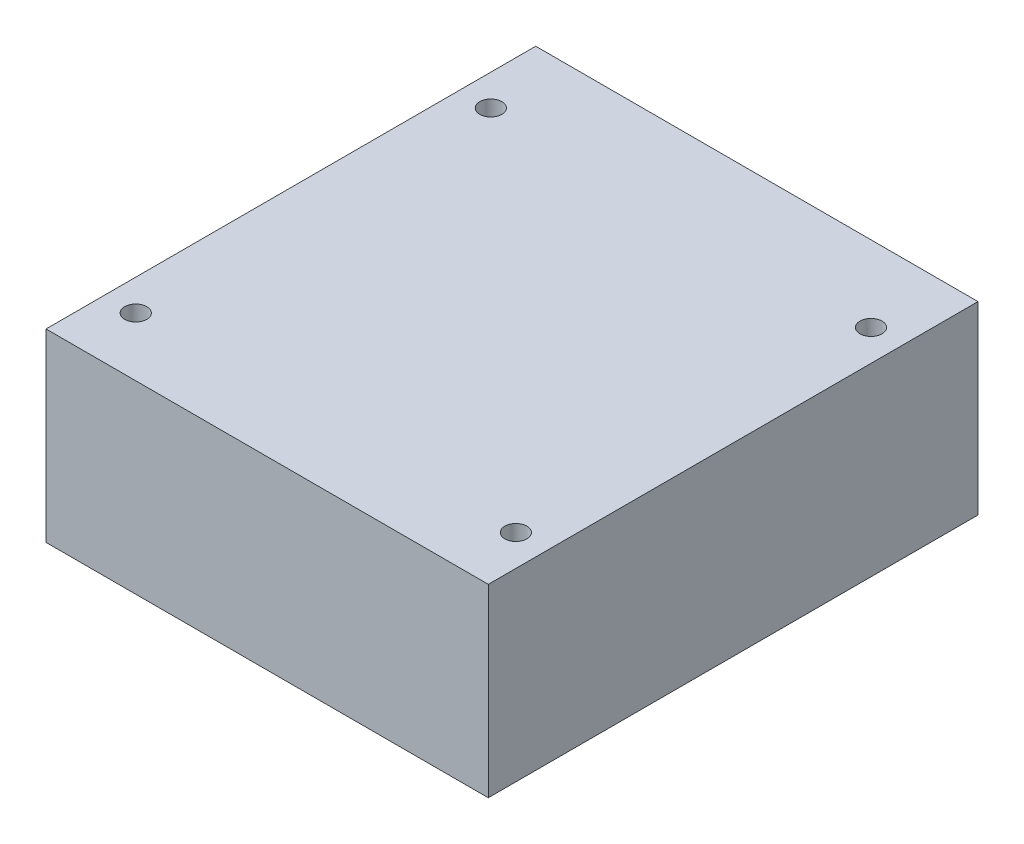
ISO-10303-21;
HEADER;
FILE_DESCRIPTION(('STEP AP214'),'2;1');
FILE_NAME('part.step','',(''),(''),'','','');
FILE_SCHEMA(('AUTOMOTIVE_DESIGN { 1 0 10303 214 1 1 1 1 }'));
ENDSEC;
DATA;
#1=APPLICATION_CONTEXT('core data for automotive mechanical design processes');
#2=APPLICATION_PROTOCOL_DEFINITION('international standard','automotive_design',2000,#1);
#3=PRODUCT_CONTEXT('',#1,'mechanical');
#4=PRODUCT('Part','Part','',(#3));
#5=PRODUCT_RELATED_PRODUCT_CATEGORY('part','',(#4));
#6=PRODUCT_DEFINITION_FORMATION('','',#4);
#7=PRODUCT_DEFINITION_CONTEXT('part definition',#1,'design');
#8=PRODUCT_DEFINITION('design','',#6,#7);
#9=PRODUCT_DEFINITION_SHAPE('','',#8);
#10=(LENGTH_UNIT() NAMED_UNIT(*) SI_UNIT(.MILLI.,.METRE.));
#11=(NAMED_UNIT(*) PLANE_ANGLE_UNIT() SI_UNIT($,.RADIAN.));
#12=(NAMED_UNIT(*) SI_UNIT($,.STERADIAN.) SOLID_ANGLE_UNIT());
#13=UNCERTAINTY_MEASURE_WITH_UNIT(LENGTH_MEASURE(1.E-05),#10,'distance_accuracy_value','');
#14=(GEOMETRIC_REPRESENTATION_CONTEXT(3) GLOBAL_UNCERTAINTY_ASSIGNED_CONTEXT((#13)) GLOBAL_UNIT_ASSIGNED_CONTEXT((#10,
#11,#12)) REPRESENTATION_CONTEXT('',''));
#15=CARTESIAN_POINT('',(0.,0.,0.));
#16=DIRECTION('',(0.,0.,1.));
#17=DIRECTION('',(1.,0.,0.));
#18=AXIS2_PLACEMENT_3D('',#15,#16,#17);
#19=CARTESIAN_POINT('',(32.035,26.78,-35.47));
#20=DIRECTION('',(-1.,0.,0.));
#21=DIRECTION('',(0.,0.,1.));
#22=AXIS2_PLACEMENT_3D('',#19,#20,#21);
#23=PLANE('',#22);
#24=DIRECTION('',(0.,0.,-1.));
#25=VECTOR('',#24,1.);
#26=CARTESIAN_POINT('',(32.035,0.,-35.47));
#27=LINE('',#26,#25);
#28=CARTESIAN_POINT('',(32.035,0.,35.47));
#29=VERTEX_POINT('',#28);
#30=CARTESIAN_POINT('',(32.035,0.,-35.47));
#31=VERTEX_POINT('',#30);
#32=EDGE_CURVE('E115',#29,#31,#27,.T.);
#33=ORIENTED_EDGE('',*,*,#32,.T.);
#34=DIRECTION('',(0.,-1.,0.));
#35=VECTOR('',#34,1.);
#36=CARTESIAN_POINT('',(32.035,26.78,-35.47));
#37=LINE('',#36,#35);
#38=CARTESIAN_POINT('',(32.035,26.78,-35.47));
#39=VERTEX_POINT('',#38);
#40=EDGE_CURVE('E11',#39,#31,#37,.T.);
#41=ORIENTED_EDGE('',*,*,#40,.F.);
#42=DIRECTION('',(0.,0.,-1.));
#43=VECTOR('',#42,1.);
#44=CARTESIAN_POINT('',(32.035,26.78,-35.47));
#45=LINE('',#44,#43);
#46=CARTESIAN_POINT('',(32.035,26.78,35.47));
#47=VERTEX_POINT('',#46);
#48=EDGE_CURVE('E99',#47,#39,#45,.T.);
#49=ORIENTED_EDGE('',*,*,#48,.F.);
#50=DIRECTION('',(0.,-1.,0.));
#51=VECTOR('',#50,1.);
#52=CARTESIAN_POINT('',(32.035,26.78,35.47));
#53=LINE('',#52,#51);
#54=EDGE_CURVE('E111',#47,#29,#53,.T.);
#55=ORIENTED_EDGE('',*,*,#54,.T.);
#56=EDGE_LOOP('',(#33,#41,#49,#55));
#57=FACE_BOUND('',#56,.T.);
#58=ADVANCED_FACE('F47',(#57),#23,.F.);
#59=CARTESIAN_POINT('',(-32.035,26.78,-35.47));
#60=DIRECTION('',(0.,0.,1.));
#61=DIRECTION('',(1.,0.,0.));
#62=AXIS2_PLACEMENT_3D('',#59,#60,#61);
#63=PLANE('',#62);
#64=DIRECTION('',(-1.,0.,0.));
#65=VECTOR('',#64,1.);
#66=CARTESIAN_POINT('',(-32.035,0.,-35.47));
#67=LINE('',#66,#65);
#68=CARTESIAN_POINT('',(-32.035,0.,-35.47));
#69=VERTEX_POINT('',#68);
#70=EDGE_CURVE('E104',#31,#69,#67,.T.);
#71=ORIENTED_EDGE('',*,*,#70,.T.);
#72=DIRECTION('',(0.,-1.,0.));
#73=VECTOR('',#72,1.);
#74=CARTESIAN_POINT('',(-32.035,26.78,-35.47));
#75=LINE('',#74,#73);
#76=CARTESIAN_POINT('',(-32.035,26.78,-35.47));
#77=VERTEX_POINT('',#76);
#78=EDGE_CURVE('E56',#77,#69,#75,.T.);
#79=ORIENTED_EDGE('',*,*,#78,.F.);
#80=DIRECTION('',(-1.,0.,0.));
#81=VECTOR('',#80,1.);
#82=CARTESIAN_POINT('',(-32.035,26.78,-35.47));
#83=LINE('',#82,#81);
#84=EDGE_CURVE('E94',#39,#77,#83,.T.);
#85=ORIENTED_EDGE('',*,*,#84,.F.);
#86=ORIENTED_EDGE('',*,*,#40,.T.);
#87=EDGE_LOOP('',(#71,#79,#85,#86));
#88=FACE_BOUND('',#87,.T.);
#89=ADVANCED_FACE('F103',(#88),#63,.F.);
#90=CARTESIAN_POINT('',(-32.035,26.78,-35.47));
#91=DIRECTION('',(1.,0.,0.));
#92=DIRECTION('',(0.,0.,-1.));
#93=AXIS2_PLACEMENT_3D('',#90,#91,#92);
#94=PLANE('',#93);
#95=DIRECTION('',(0.,0.,1.));
#96=VECTOR('',#95,1.);
#97=CARTESIAN_POINT('',(-32.035,0.,-35.47));
#98=LINE('',#97,#96);
#99=CARTESIAN_POINT('',(-32.035,0.,35.47));
#100=VERTEX_POINT('',#99);
#101=EDGE_CURVE('E81',#69,#100,#98,.T.);
#102=ORIENTED_EDGE('',*,*,#101,.T.);
#103=DIRECTION('',(0.,-1.,0.));
#104=VECTOR('',#103,1.);
#105=CARTESIAN_POINT('',(-32.035,26.78,35.47));
#106=LINE('',#105,#104);
#107=CARTESIAN_POINT('',(-32.035,26.78,35.47));
#108=VERTEX_POINT('',#107);
#109=EDGE_CURVE('E106',#108,#100,#106,.T.);
#110=ORIENTED_EDGE('',*,*,#109,.F.);
#111=DIRECTION('',(0.,0.,1.));
#112=VECTOR('',#111,1.);
#113=CARTESIAN_POINT('',(-32.035,26.78,-35.47));
#114=LINE('',#113,#112);
#115=EDGE_CURVE('E97',#77,#108,#114,.T.);
#116=ORIENTED_EDGE('',*,*,#115,.F.);
#117=ORIENTED_EDGE('',*,*,#78,.T.);
#118=EDGE_LOOP('',(#102,#110,#116,#117));
#119=FACE_BOUND('',#118,.T.);
#120=ADVANCED_FACE('F107',(#119),#94,.F.);
#121=CARTESIAN_POINT('',(-32.035,26.78,35.47));
#122=DIRECTION('',(0.,0.,-1.));
#123=DIRECTION('',(-1.,0.,0.));
#124=AXIS2_PLACEMENT_3D('',#121,#122,#123);
#125=PLANE('',#124);
#126=DIRECTION('',(1.,0.,0.));
#127=VECTOR('',#126,1.);
#128=CARTESIAN_POINT('',(-32.035,0.,35.47));
#129=LINE('',#128,#127);
#130=EDGE_CURVE('E87',#100,#29,#129,.T.);
#131=ORIENTED_EDGE('',*,*,#130,.T.);
#132=ORIENTED_EDGE('',*,*,#54,.F.);
#133=DIRECTION('',(1.,0.,0.));
#134=VECTOR('',#133,1.);
#135=CARTESIAN_POINT('',(-32.035,26.78,35.47));
#136=LINE('',#135,#134);
#137=EDGE_CURVE('E64',#108,#47,#136,.T.);
#138=ORIENTED_EDGE('',*,*,#137,.F.);
#139=ORIENTED_EDGE('',*,*,#109,.T.);
#140=EDGE_LOOP('',(#131,#132,#138,#139));
#141=FACE_BOUND('',#140,.T.);
#142=ADVANCED_FACE('F129',(#141),#125,.F.);
#143=CARTESIAN_POINT('',(0.,26.78,0.));
#144=DIRECTION('',(0.,1.,0.));
#145=DIRECTION('',(0.,0.,1.));
#146=AXIS2_PLACEMENT_3D('',#143,#144,#145);
#147=PLANE('',#146);
#148=CARTESIAN_POINT('',(27.535,26.78,-24.47));
#149=DIRECTION('',(0.,1.,0.));
#150=DIRECTION('',(0.,0.,-1.));
#151=AXIS2_PLACEMENT_3D('',#148,#149,#150);
#152=CIRCLE('',#151,1.6);
#153=CARTESIAN_POINT('',(27.535,26.78,-22.87));
#154=VERTEX_POINT('',#153);
#155=EDGE_CURVE('E140',#154,#154,#152,.T.);
#156=ORIENTED_EDGE('',*,*,#155,.F.);
#157=EDGE_LOOP('',(#156));
#158=FACE_BOUND('',#157,.T.);
#159=CARTESIAN_POINT('',(-27.535,26.78,26.97));
#160=DIRECTION('',(0.,1.,0.));
#161=DIRECTION('',(0.,0.,1.));
#162=AXIS2_PLACEMENT_3D('',#159,#160,#161);
#163=CIRCLE('',#162,1.6);
#164=CARTESIAN_POINT('',(-27.535,26.78,28.57));
#165=VERTEX_POINT('',#164);
#166=EDGE_CURVE('E148',#165,#165,#163,.T.);
#167=ORIENTED_EDGE('',*,*,#166,.F.);
#168=EDGE_LOOP('',(#167));
#169=FACE_BOUND('',#168,.T.);
#170=CARTESIAN_POINT('',(27.535,26.78,26.97));
#171=DIRECTION('',(0.,1.,0.));
#172=DIRECTION('',(0.,0.,-1.));
#173=AXIS2_PLACEMENT_3D('',#170,#171,#172);
#174=CIRCLE('',#173,1.6);
#175=CARTESIAN_POINT('',(27.535,26.78,28.57));
#176=VERTEX_POINT('',#175);
#177=EDGE_CURVE('E149',#176,#176,#174,.T.);
#178=ORIENTED_EDGE('',*,*,#177,.F.);
#179=EDGE_LOOP('',(#178));
#180=FACE_BOUND('',#179,.T.);
#181=CARTESIAN_POINT('',(-27.535,26.78,-24.47));
#182=DIRECTION('',(0.,1.,0.));
#183=DIRECTION('',(0.,0.,1.));
#184=AXIS2_PLACEMENT_3D('',#181,#182,#183);
#185=CIRCLE('',#184,1.6);
#186=CARTESIAN_POINT('',(-27.535,26.78,-22.87));
#187=VERTEX_POINT('',#186);
#188=EDGE_CURVE('E136',#187,#187,#185,.T.);
#189=ORIENTED_EDGE('',*,*,#188,.F.);
#190=EDGE_LOOP('',(#189));
#191=FACE_BOUND('',#190,.T.);
#192=ORIENTED_EDGE('',*,*,#48,.T.);
#193=ORIENTED_EDGE('',*,*,#84,.T.);
#194=ORIENTED_EDGE('',*,*,#115,.T.);
#195=ORIENTED_EDGE('',*,*,#137,.T.);
#196=EDGE_LOOP('',(#192,#193,#194,#195));
#197=FACE_BOUND('',#196,.T.);
#198=ADVANCED_FACE('F95',(#158,#169,#180,#191,#197),#147,.T.);
#199=CARTESIAN_POINT('',(0.,0.,0.));
#200=DIRECTION('',(0.,1.,0.));
#201=DIRECTION('',(0.,0.,1.));
#202=AXIS2_PLACEMENT_3D('',#199,#200,#201);
#203=PLANE('',#202);
#204=CARTESIAN_POINT('',(27.535,0.,-24.47));
#205=DIRECTION('',(0.,1.,0.));
#206=DIRECTION('',(0.,0.,-1.));
#207=AXIS2_PLACEMENT_3D('',#204,#205,#206);
#208=CIRCLE('',#207,1.6);
#209=CARTESIAN_POINT('',(27.535,0.,-22.87));
#210=VERTEX_POINT('',#209);
#211=EDGE_CURVE('E153',#210,#210,#208,.T.);
#212=ORIENTED_EDGE('',*,*,#211,.T.);
#213=EDGE_LOOP('',(#212));
#214=FACE_BOUND('',#213,.T.);
#215=CARTESIAN_POINT('',(-27.535,0.,26.97));
#216=DIRECTION('',(0.,1.,0.));
#217=DIRECTION('',(0.,0.,1.));
#218=AXIS2_PLACEMENT_3D('',#215,#216,#217);
#219=CIRCLE('',#218,1.6);
#220=CARTESIAN_POINT('',(-27.535,0.,28.57));
#221=VERTEX_POINT('',#220);
#222=EDGE_CURVE('E144',#221,#221,#219,.T.);
#223=ORIENTED_EDGE('',*,*,#222,.T.);
#224=EDGE_LOOP('',(#223));
#225=FACE_BOUND('',#224,.T.);
#226=CARTESIAN_POINT('',(27.535,0.,26.97));
#227=DIRECTION('',(0.,1.,0.));
#228=DIRECTION('',(0.,0.,-1.));
#229=AXIS2_PLACEMENT_3D('',#226,#227,#228);
#230=CIRCLE('',#229,1.6);
#231=CARTESIAN_POINT('',(27.535,0.,28.57));
#232=VERTEX_POINT('',#231);
#233=EDGE_CURVE('E160',#232,#232,#230,.T.);
#234=ORIENTED_EDGE('',*,*,#233,.T.);
#235=EDGE_LOOP('',(#234));
#236=FACE_BOUND('',#235,.T.);
#237=CARTESIAN_POINT('',(-27.535,0.,-24.47));
#238=DIRECTION('',(0.,1.,0.));
#239=DIRECTION('',(0.,0.,1.));
#240=AXIS2_PLACEMENT_3D('',#237,#238,#239);
#241=CIRCLE('',#240,1.6);
#242=CARTESIAN_POINT('',(-27.535,0.,-22.87));
#243=VERTEX_POINT('',#242);
#244=EDGE_CURVE('E119',#243,#243,#241,.T.);
#245=ORIENTED_EDGE('',*,*,#244,.T.);
#246=EDGE_LOOP('',(#245));
#247=FACE_BOUND('',#246,.T.);
#248=ORIENTED_EDGE('',*,*,#32,.F.);
#249=ORIENTED_EDGE('',*,*,#130,.F.);
#250=ORIENTED_EDGE('',*,*,#101,.F.);
#251=ORIENTED_EDGE('',*,*,#70,.F.);
#252=EDGE_LOOP('',(#248,#249,#250,#251));
#253=FACE_BOUND('',#252,.T.);
#254=ADVANCED_FACE('F132',(#214,#225,#236,#247,#253),#203,.F.);
#255=CARTESIAN_POINT('',(-27.535,0.,-24.47));
#256=DIRECTION('',(0.,1.,0.));
#257=DIRECTION('',(0.,0.,1.));
#258=AXIS2_PLACEMENT_3D('',#255,#256,#257);
#259=CYLINDRICAL_SURFACE('',#258,1.6);
#260=CARTESIAN_POINT('',(-27.535,0.,-22.87));
#261=CARTESIAN_POINT('',(-27.535,0.278958333333333,-22.87));
#262=CARTESIAN_POINT('',(-27.535,0.557916666666667,-22.87));
#263=CARTESIAN_POINT('',(-27.535,1.11583333333333,-22.87));
#264=CARTESIAN_POINT('',(-27.535,1.39479166666667,-22.87));
#265=CARTESIAN_POINT('',(-27.535,1.95270833333333,-22.87));
#266=CARTESIAN_POINT('',(-27.535,2.23166666666667,-22.87));
#267=CARTESIAN_POINT('',(-27.535,2.78958333333333,-22.87));
#268=CARTESIAN_POINT('',(-27.535,3.06854166666667,-22.87));
#269=CARTESIAN_POINT('',(-27.535,3.62645833333333,-22.87));
#270=CARTESIAN_POINT('',(-27.535,3.90541666666667,-22.87));
#271=CARTESIAN_POINT('',(-27.535,4.46333333333333,-22.87));
#272=CARTESIAN_POINT('',(-27.535,4.74229166666667,-22.87));
#273=CARTESIAN_POINT('',(-27.535,5.30020833333333,-22.87));
#274=CARTESIAN_POINT('',(-27.535,5.57916666666667,-22.87));
#275=CARTESIAN_POINT('',(-27.535,6.13708333333333,-22.87));
#276=CARTESIAN_POINT('',(-27.535,6.41604166666667,-22.87));
#277=CARTESIAN_POINT('',(-27.535,6.97395833333333,-22.87));
#278=CARTESIAN_POINT('',(-27.535,7.25291666666667,-22.87));
#279=CARTESIAN_POINT('',(-27.535,7.81083333333333,-22.87));
#280=CARTESIAN_POINT('',(-27.535,8.08979166666667,-22.87));
#281=CARTESIAN_POINT('',(-27.535,8.64770833333333,-22.87));
#282=CARTESIAN_POINT('',(-27.535,8.92666666666667,-22.87));
#283=CARTESIAN_POINT('',(-27.535,9.48458333333333,-22.87));
#284=CARTESIAN_POINT('',(-27.535,9.76354166666667,-22.87));
#285=CARTESIAN_POINT('',(-27.535,10.3214583333333,-22.87));
#286=CARTESIAN_POINT('',(-27.535,10.6004166666667,-22.87));
#287=CARTESIAN_POINT('',(-27.535,11.1583333333333,-22.87));
#288=CARTESIAN_POINT('',(-27.535,11.4372916666667,-22.87));
#289=CARTESIAN_POINT('',(-27.535,11.9952083333333,-22.87));
#290=CARTESIAN_POINT('',(-27.535,12.2741666666667,-22.87));
#291=CARTESIAN_POINT('',(-27.535,12.8320833333333,-22.87));
#292=CARTESIAN_POINT('',(-27.535,13.1110416666667,-22.87));
#293=CARTESIAN_POINT('',(-27.535,13.6689583333333,-22.87));
#294=CARTESIAN_POINT('',(-27.535,13.9479166666667,-22.87));
#295=CARTESIAN_POINT('',(-27.535,14.5058333333333,-22.87));
#296=CARTESIAN_POINT('',(-27.535,14.7847916666667,-22.87));
#297=CARTESIAN_POINT('',(-27.535,15.3427083333333,-22.87));
#298=CARTESIAN_POINT('',(-27.535,15.6216666666667,-22.87));
#299=CARTESIAN_POINT('',(-27.535,16.1795833333333,-22.87));
#300=CARTESIAN_POINT('',(-27.535,16.4585416666667,-22.87));
#301=CARTESIAN_POINT('',(-27.535,17.0164583333333,-22.87));
#302=CARTESIAN_POINT('',(-27.535,17.2954166666667,-22.87));
#303=CARTESIAN_POINT('',(-27.535,17.8533333333333,-22.87));
#304=CARTESIAN_POINT('',(-27.535,18.1322916666667,-22.87));
#305=CARTESIAN_POINT('',(-27.535,18.6902083333333,-22.87));
#306=CARTESIAN_POINT('',(-27.535,18.9691666666667,-22.87));
#307=CARTESIAN_POINT('',(-27.535,19.5270833333333,-22.87));
#308=CARTESIAN_POINT('',(-27.535,19.8060416666667,-22.87));
#309=CARTESIAN_POINT('',(-27.535,20.3639583333333,-22.87));
#310=CARTESIAN_POINT('',(-27.535,20.6429166666667,-22.87));
#311=CARTESIAN_POINT('',(-27.535,21.2008333333333,-22.87));
#312=CARTESIAN_POINT('',(-27.535,21.4797916666667,-22.87));
#313=CARTESIAN_POINT('',(-27.535,22.0377083333333,-22.87));
#314=CARTESIAN_POINT('',(-27.535,22.3166666666667,-22.87));
#315=CARTESIAN_POINT('',(-27.535,22.8745833333333,-22.87));
#316=CARTESIAN_POINT('',(-27.535,23.1535416666667,-22.87));
#317=CARTESIAN_POINT('',(-27.535,23.7114583333333,-22.87));
#318=CARTESIAN_POINT('',(-27.535,23.9904166666667,-22.87));
#319=CARTESIAN_POINT('',(-27.535,24.5483333333333,-22.87));
#320=CARTESIAN_POINT('',(-27.535,24.8272916666667,-22.87));
#321=CARTESIAN_POINT('',(-27.535,25.3852083333333,-22.87));
#322=CARTESIAN_POINT('',(-27.535,25.6641666666667,-22.87));
#323=CARTESIAN_POINT('',(-27.535,26.2220833333333,-22.87));
#324=CARTESIAN_POINT('',(-27.535,26.5010416666667,-22.87));
#325=CARTESIAN_POINT('',(-27.535,26.78,-22.87));
#326=B_SPLINE_CURVE_WITH_KNOTS('',3,(#260,#261,#262,#263,#264,#265,#266,#267,#268,#269,#270,
#271,#272,#273,#274,#275,#276,#277,#278,#279,#280,#281,#282,#283,#284,#285,#286,#287,#288,#289,
#290,#291,#292,#293,#294,#295,#296,#297,#298,#299,#300,#301,#302,#303,#304,#305,#306,#307,#308,
#309,#310,#311,#312,#313,#314,#315,#316,#317,#318,#319,#320,#321,#322,#323,#324,#325),
.UNSPECIFIED.,.F.,.F.,(4,2,2,2,2,2,2,2,2,2,2,2,2,2,2,2,2,2,2,2,2,2,2,2,2,2,2,2,2,2,2,2,4),(0.,
0.836875,1.67375,2.510625,3.3475,4.184375,5.02125,5.858125,6.695,7.531875,8.36875,9.205625,
10.0425,10.879375,11.71625,12.553125,13.39,14.226875,15.06375,15.900625,16.7375,17.574375,
18.41125,19.248125,20.085,20.921875,21.75875,22.595625,23.4325,24.269375,25.10625,25.943125,
26.78),.UNSPECIFIED.);
#327=EDGE_CURVE('BSEAM176',#243,#187,#326,.T.);
#328=ORIENTED_EDGE('',*,*,#244,.F.);
#329=ORIENTED_EDGE('',*,*,#188,.T.);
#330=ORIENTED_EDGE('',*,*,#327,.T.);
#331=ORIENTED_EDGE('',*,*,#327,.F.);
#332=EDGE_LOOP('',(#328,#330,#329,#331));
#333=FACE_BOUND('',#332,.T.);
#334=ADVANCED_FACE('F176',(#333),#259,.F.);
#335=CARTESIAN_POINT('',(27.535,0.,26.97));
#336=DIRECTION('',(0.,1.,0.));
#337=DIRECTION('',(0.,0.,1.));
#338=AXIS2_PLACEMENT_3D('',#335,#336,#337);
#339=CYLINDRICAL_SURFACE('',#338,1.6);
#340=CARTESIAN_POINT('',(27.535,0.,28.57));
#341=CARTESIAN_POINT('',(27.535,0.278958333333333,28.57));
#342=CARTESIAN_POINT('',(27.535,0.557916666666667,28.57));
#343=CARTESIAN_POINT('',(27.535,1.11583333333333,28.57));
#344=CARTESIAN_POINT('',(27.535,1.39479166666667,28.57));
#345=CARTESIAN_POINT('',(27.535,1.95270833333333,28.57));
#346=CARTESIAN_POINT('',(27.535,2.23166666666667,28.57));
#347=CARTESIAN_POINT('',(27.535,2.78958333333333,28.57));
#348=CARTESIAN_POINT('',(27.535,3.06854166666667,28.57));
#349=CARTESIAN_POINT('',(27.535,3.62645833333333,28.57));
#350=CARTESIAN_POINT('',(27.535,3.90541666666667,28.57));
#351=CARTESIAN_POINT('',(27.535,4.46333333333333,28.57));
#352=CARTESIAN_POINT('',(27.535,4.74229166666667,28.57));
#353=CARTESIAN_POINT('',(27.535,5.30020833333333,28.57));
#354=CARTESIAN_POINT('',(27.535,5.57916666666667,28.57));
#355=CARTESIAN_POINT('',(27.535,6.13708333333333,28.57));
#356=CARTESIAN_POINT('',(27.535,6.41604166666667,28.57));
#357=CARTESIAN_POINT('',(27.535,6.97395833333333,28.57));
#358=CARTESIAN_POINT('',(27.535,7.25291666666667,28.57));
#359=CARTESIAN_POINT('',(27.535,7.81083333333333,28.57));
#360=CARTESIAN_POINT('',(27.535,8.08979166666667,28.57));
#361=CARTESIAN_POINT('',(27.535,8.64770833333333,28.57));
#362=CARTESIAN_POINT('',(27.535,8.92666666666667,28.57));
#363=CARTESIAN_POINT('',(27.535,9.48458333333333,28.57));
#364=CARTESIAN_POINT('',(27.535,9.76354166666667,28.57));
#365=CARTESIAN_POINT('',(27.535,10.3214583333333,28.57));
#366=CARTESIAN_POINT('',(27.535,10.6004166666667,28.57));
#367=CARTESIAN_POINT('',(27.535,11.1583333333333,28.57));
#368=CARTESIAN_POINT('',(27.535,11.4372916666667,28.57));
#369=CARTESIAN_POINT('',(27.535,11.9952083333333,28.57));
#370=CARTESIAN_POINT('',(27.535,12.2741666666667,28.57));
#371=CARTESIAN_POINT('',(27.535,12.8320833333333,28.57));
#372=CARTESIAN_POINT('',(27.535,13.1110416666667,28.57));
#373=CARTESIAN_POINT('',(27.535,13.6689583333333,28.57));
#374=CARTESIAN_POINT('',(27.535,13.9479166666667,28.57));
#375=CARTESIAN_POINT('',(27.535,14.5058333333333,28.57));
#376=CARTESIAN_POINT('',(27.535,14.7847916666667,28.57));
#377=CARTESIAN_POINT('',(27.535,15.3427083333333,28.57));
#378=CARTESIAN_POINT('',(27.535,15.6216666666667,28.57));
#379=CARTESIAN_POINT('',(27.535,16.1795833333333,28.57));
#380=CARTESIAN_POINT('',(27.535,16.4585416666667,28.57));
#381=CARTESIAN_POINT('',(27.535,17.0164583333333,28.57));
#382=CARTESIAN_POINT('',(27.535,17.2954166666667,28.57));
#383=CARTESIAN_POINT('',(27.535,17.8533333333333,28.57));
#384=CARTESIAN_POINT('',(27.535,18.1322916666667,28.57));
#385=CARTESIAN_POINT('',(27.535,18.6902083333333,28.57));
#386=CARTESIAN_POINT('',(27.535,18.9691666666667,28.57));
#387=CARTESIAN_POINT('',(27.535,19.5270833333333,28.57));
#388=CARTESIAN_POINT('',(27.535,19.8060416666667,28.57));
#389=CARTESIAN_POINT('',(27.535,20.3639583333333,28.57));
#390=CARTESIAN_POINT('',(27.535,20.6429166666667,28.57));
#391=CARTESIAN_POINT('',(27.535,21.2008333333333,28.57));
#392=CARTESIAN_POINT('',(27.535,21.4797916666667,28.57));
#393=CARTESIAN_POINT('',(27.535,22.0377083333333,28.57));
#394=CARTESIAN_POINT('',(27.535,22.3166666666667,28.57));
#395=CARTESIAN_POINT('',(27.535,22.8745833333333,28.57));
#396=CARTESIAN_POINT('',(27.535,23.1535416666667,28.57));
#397=CARTESIAN_POINT('',(27.535,23.7114583333333,28.57));
#398=CARTESIAN_POINT('',(27.535,23.9904166666667,28.57));
#399=CARTESIAN_POINT('',(27.535,24.5483333333333,28.57));
#400=CARTESIAN_POINT('',(27.535,24.8272916666667,28.57));
#401=CARTESIAN_POINT('',(27.535,25.3852083333333,28.57));
#402=CARTESIAN_POINT('',(27.535,25.6641666666667,28.57));
#403=CARTESIAN_POINT('',(27.535,26.2220833333333,28.57));
#404=CARTESIAN_POINT('',(27.535,26.5010416666667,28.57));
#405=CARTESIAN_POINT('',(27.535,26.78,28.57));
#406=B_SPLINE_CURVE_WITH_KNOTS('',3,(#340,#341,#342,#343,#344,#345,#346,#347,#348,#349,#350,
#351,#352,#353,#354,#355,#356,#357,#358,#359,#360,#361,#362,#363,#364,#365,#366,#367,#368,#369,
#370,#371,#372,#373,#374,#375,#376,#377,#378,#379,#380,#381,#382,#383,#384,#385,#386,#387,#388,
#389,#390,#391,#392,#393,#394,#395,#396,#397,#398,#399,#400,#401,#402,#403,#404,#405),
.UNSPECIFIED.,.F.,.F.,(4,2,2,2,2,2,2,2,2,2,2,2,2,2,2,2,2,2,2,2,2,2,2,2,2,2,2,2,2,2,2,2,4),(0.,
0.836875,1.67375,2.510625,3.3475,4.184375,5.02125,5.858125,6.695,7.531875,8.36875,9.205625,
10.0425,10.879375,11.71625,12.553125,13.39,14.226875,15.06375,15.900625,16.7375,17.574375,
18.41125,19.248125,20.085,20.921875,21.75875,22.595625,23.4325,24.269375,25.10625,25.943125,
26.78),.UNSPECIFIED.);
#407=EDGE_CURVE('BSEAM168',#232,#176,#406,.T.);
#408=ORIENTED_EDGE('',*,*,#233,.F.);
#409=ORIENTED_EDGE('',*,*,#177,.T.);
#410=ORIENTED_EDGE('',*,*,#407,.T.);
#411=ORIENTED_EDGE('',*,*,#407,.F.);
#412=EDGE_LOOP('',(#408,#410,#409,#411));
#413=FACE_BOUND('',#412,.T.);
#414=ADVANCED_FACE('F168',(#413),#339,.F.);
#415=CARTESIAN_POINT('',(-27.535,0.,26.97));
#416=DIRECTION('',(0.,1.,0.));
#417=DIRECTION('',(0.,0.,1.));
#418=AXIS2_PLACEMENT_3D('',#415,#416,#417);
#419=CYLINDRICAL_SURFACE('',#418,1.6);
#420=CARTESIAN_POINT('',(-27.535,0.,28.57));
#421=CARTESIAN_POINT('',(-27.535,0.278958333333333,28.57));
#422=CARTESIAN_POINT('',(-27.535,0.557916666666667,28.57));
#423=CARTESIAN_POINT('',(-27.535,1.11583333333333,28.57));
#424=CARTESIAN_POINT('',(-27.535,1.39479166666667,28.57));
#425=CARTESIAN_POINT('',(-27.535,1.95270833333333,28.57));
#426=CARTESIAN_POINT('',(-27.535,2.23166666666667,28.57));
#427=CARTESIAN_POINT('',(-27.535,2.78958333333333,28.57));
#428=CARTESIAN_POINT('',(-27.535,3.06854166666667,28.57));
#429=CARTESIAN_POINT('',(-27.535,3.62645833333333,28.57));
#430=CARTESIAN_POINT('',(-27.535,3.90541666666667,28.57));
#431=CARTESIAN_POINT('',(-27.535,4.46333333333333,28.57));
#432=CARTESIAN_POINT('',(-27.535,4.74229166666667,28.57));
#433=CARTESIAN_POINT('',(-27.535,5.30020833333333,28.57));
#434=CARTESIAN_POINT('',(-27.535,5.57916666666667,28.57));
#435=CARTESIAN_POINT('',(-27.535,6.13708333333333,28.57));
#436=CARTESIAN_POINT('',(-27.535,6.41604166666667,28.57));
#437=CARTESIAN_POINT('',(-27.535,6.97395833333333,28.57));
#438=CARTESIAN_POINT('',(-27.535,7.25291666666667,28.57));
#439=CARTESIAN_POINT('',(-27.535,7.81083333333333,28.57));
#440=CARTESIAN_POINT('',(-27.535,8.08979166666667,28.57));
#441=CARTESIAN_POINT('',(-27.535,8.64770833333333,28.57));
#442=CARTESIAN_POINT('',(-27.535,8.92666666666667,28.57));
#443=CARTESIAN_POINT('',(-27.535,9.48458333333333,28.57));
#444=CARTESIAN_POINT('',(-27.535,9.76354166666667,28.57));
#445=CARTESIAN_POINT('',(-27.535,10.3214583333333,28.57));
#446=CARTESIAN_POINT('',(-27.535,10.6004166666667,28.57));
#447=CARTESIAN_POINT('',(-27.535,11.1583333333333,28.57));
#448=CARTESIAN_POINT('',(-27.535,11.4372916666667,28.57));
#449=CARTESIAN_POINT('',(-27.535,11.9952083333333,28.57));
#450=CARTESIAN_POINT('',(-27.535,12.2741666666667,28.57));
#451=CARTESIAN_POINT('',(-27.535,12.8320833333333,28.57));
#452=CARTESIAN_POINT('',(-27.535,13.1110416666667,28.57));
#453=CARTESIAN_POINT('',(-27.535,13.6689583333333,28.57));
#454=CARTESIAN_POINT('',(-27.535,13.9479166666667,28.57));
#455=CARTESIAN_POINT('',(-27.535,14.5058333333333,28.57));
#456=CARTESIAN_POINT('',(-27.535,14.7847916666667,28.57));
#457=CARTESIAN_POINT('',(-27.535,15.3427083333333,28.57));
#458=CARTESIAN_POINT('',(-27.535,15.6216666666667,28.57));
#459=CARTESIAN_POINT('',(-27.535,16.1795833333333,28.57));
#460=CARTESIAN_POINT('',(-27.535,16.4585416666667,28.57));
#461=CARTESIAN_POINT('',(-27.535,17.0164583333333,28.57));
#462=CARTESIAN_POINT('',(-27.535,17.2954166666667,28.57));
#463=CARTESIAN_POINT('',(-27.535,17.8533333333333,28.57));
#464=CARTESIAN_POINT('',(-27.535,18.1322916666667,28.57));
#465=CARTESIAN_POINT('',(-27.535,18.6902083333333,28.57));
#466=CARTESIAN_POINT('',(-27.535,18.9691666666667,28.57));
#467=CARTESIAN_POINT('',(-27.535,19.5270833333333,28.57));
#468=CARTESIAN_POINT('',(-27.535,19.8060416666667,28.57));
#469=CARTESIAN_POINT('',(-27.535,20.3639583333333,28.57));
#470=CARTESIAN_POINT('',(-27.535,20.6429166666667,28.57));
#471=CARTESIAN_POINT('',(-27.535,21.2008333333333,28.57));
#472=CARTESIAN_POINT('',(-27.535,21.4797916666667,28.57));
#473=CARTESIAN_POINT('',(-27.535,22.0377083333333,28.57));
#474=CARTESIAN_POINT('',(-27.535,22.3166666666667,28.57));
#475=CARTESIAN_POINT('',(-27.535,22.8745833333333,28.57));
#476=CARTESIAN_POINT('',(-27.535,23.1535416666667,28.57));
#477=CARTESIAN_POINT('',(-27.535,23.7114583333333,28.57));
#478=CARTESIAN_POINT('',(-27.535,23.9904166666667,28.57));
#479=CARTESIAN_POINT('',(-27.535,24.5483333333333,28.57));
#480=CARTESIAN_POINT('',(-27.535,24.8272916666667,28.57));
#481=CARTESIAN_POINT('',(-27.535,25.3852083333333,28.57));
#482=CARTESIAN_POINT('',(-27.535,25.6641666666667,28.57));
#483=CARTESIAN_POINT('',(-27.535,26.2220833333333,28.57));
#484=CARTESIAN_POINT('',(-27.535,26.5010416666667,28.57));
#485=CARTESIAN_POINT('',(-27.535,26.78,28.57));
#486=B_SPLINE_CURVE_WITH_KNOTS('',3,(#420,#421,#422,#423,#424,#425,#426,#427,#428,#429,#430,
#431,#432,#433,#434,#435,#436,#437,#438,#439,#440,#441,#442,#443,#444,#445,#446,#447,#448,#449,
#450,#451,#452,#453,#454,#455,#456,#457,#458,#459,#460,#461,#462,#463,#464,#465,#466,#467,#468,
#469,#470,#471,#472,#473,#474,#475,#476,#477,#478,#479,#480,#481,#482,#483,#484,#485),
.UNSPECIFIED.,.F.,.F.,(4,2,2,2,2,2,2,2,2,2,2,2,2,2,2,2,2,2,2,2,2,2,2,2,2,2,2,2,2,2,2,2,4),(0.,
0.836875,1.67375,2.510625,3.3475,4.184375,5.02125,5.858125,6.695,7.531875,8.36875,9.205625,
10.0425,10.879375,11.71625,12.553125,13.39,14.226875,15.06375,15.900625,16.7375,17.574375,
18.41125,19.248125,20.085,20.921875,21.75875,22.595625,23.4325,24.269375,25.10625,25.943125,
26.78),.UNSPECIFIED.);
#487=EDGE_CURVE('BSEAM184',#221,#165,#486,.T.);
#488=ORIENTED_EDGE('',*,*,#222,.F.);
#489=ORIENTED_EDGE('',*,*,#166,.T.);
#490=ORIENTED_EDGE('',*,*,#487,.T.);
#491=ORIENTED_EDGE('',*,*,#487,.F.);
#492=EDGE_LOOP('',(#488,#490,#489,#491));
#493=FACE_BOUND('',#492,.T.);
#494=ADVANCED_FACE('F184',(#493),#419,.F.);
#495=CARTESIAN_POINT('',(27.535,0.,-24.47));
#496=DIRECTION('',(0.,1.,0.));
#497=DIRECTION('',(0.,0.,1.));
#498=AXIS2_PLACEMENT_3D('',#495,#496,#497);
#499=CYLINDRICAL_SURFACE('',#498,1.6);
#500=CARTESIAN_POINT('',(27.535,0.,-22.87));
#501=CARTESIAN_POINT('',(27.535,0.278958333333333,-22.87));
#502=CARTESIAN_POINT('',(27.535,0.557916666666667,-22.87));
#503=CARTESIAN_POINT('',(27.535,1.11583333333333,-22.87));
#504=CARTESIAN_POINT('',(27.535,1.39479166666667,-22.87));
#505=CARTESIAN_POINT('',(27.535,1.95270833333333,-22.87));
#506=CARTESIAN_POINT('',(27.535,2.23166666666667,-22.87));
#507=CARTESIAN_POINT('',(27.535,2.78958333333333,-22.87));
#508=CARTESIAN_POINT('',(27.535,3.06854166666667,-22.87));
#509=CARTESIAN_POINT('',(27.535,3.62645833333333,-22.87));
#510=CARTESIAN_POINT('',(27.535,3.90541666666667,-22.87));
#511=CARTESIAN_POINT('',(27.535,4.46333333333333,-22.87));
#512=CARTESIAN_POINT('',(27.535,4.74229166666667,-22.87));
#513=CARTESIAN_POINT('',(27.535,5.30020833333333,-22.87));
#514=CARTESIAN_POINT('',(27.535,5.57916666666667,-22.87));
#515=CARTESIAN_POINT('',(27.535,6.13708333333333,-22.87));
#516=CARTESIAN_POINT('',(27.535,6.41604166666667,-22.87));
#517=CARTESIAN_POINT('',(27.535,6.97395833333333,-22.87));
#518=CARTESIAN_POINT('',(27.535,7.25291666666667,-22.87));
#519=CARTESIAN_POINT('',(27.535,7.81083333333333,-22.87));
#520=CARTESIAN_POINT('',(27.535,8.08979166666667,-22.87));
#521=CARTESIAN_POINT('',(27.535,8.64770833333333,-22.87));
#522=CARTESIAN_POINT('',(27.535,8.92666666666667,-22.87));
#523=CARTESIAN_POINT('',(27.535,9.48458333333333,-22.87));
#524=CARTESIAN_POINT('',(27.535,9.76354166666667,-22.87));
#525=CARTESIAN_POINT('',(27.535,10.3214583333333,-22.87));
#526=CARTESIAN_POINT('',(27.535,10.6004166666667,-22.87));
#527=CARTESIAN_POINT('',(27.535,11.1583333333333,-22.87));
#528=CARTESIAN_POINT('',(27.535,11.4372916666667,-22.87));
#529=CARTESIAN_POINT('',(27.535,11.9952083333333,-22.87));
#530=CARTESIAN_POINT('',(27.535,12.2741666666667,-22.87));
#531=CARTESIAN_POINT('',(27.535,12.8320833333333,-22.87));
#532=CARTESIAN_POINT('',(27.535,13.1110416666667,-22.87));
#533=CARTESIAN_POINT('',(27.535,13.6689583333333,-22.87));
#534=CARTESIAN_POINT('',(27.535,13.9479166666667,-22.87));
#535=CARTESIAN_POINT('',(27.535,14.5058333333333,-22.87));
#536=CARTESIAN_POINT('',(27.535,14.7847916666667,-22.87));
#537=CARTESIAN_POINT('',(27.535,15.3427083333333,-22.87));
#538=CARTESIAN_POINT('',(27.535,15.6216666666667,-22.87));
#539=CARTESIAN_POINT('',(27.535,16.1795833333333,-22.87));
#540=CARTESIAN_POINT('',(27.535,16.4585416666667,-22.87));
#541=CARTESIAN_POINT('',(27.535,17.0164583333333,-22.87));
#542=CARTESIAN_POINT('',(27.535,17.2954166666667,-22.87));
#543=CARTESIAN_POINT('',(27.535,17.8533333333333,-22.87));
#544=CARTESIAN_POINT('',(27.535,18.1322916666667,-22.87));
#545=CARTESIAN_POINT('',(27.535,18.6902083333333,-22.87));
#546=CARTESIAN_POINT('',(27.535,18.9691666666667,-22.87));
#547=CARTESIAN_POINT('',(27.535,19.5270833333333,-22.87));
#548=CARTESIAN_POINT('',(27.535,19.8060416666667,-22.87));
#549=CARTESIAN_POINT('',(27.535,20.3639583333333,-22.87));
#550=CARTESIAN_POINT('',(27.535,20.6429166666667,-22.87));
#551=CARTESIAN_POINT('',(27.535,21.2008333333333,-22.87));
#552=CARTESIAN_POINT('',(27.535,21.4797916666667,-22.87));
#553=CARTESIAN_POINT('',(27.535,22.0377083333333,-22.87));
#554=CARTESIAN_POINT('',(27.535,22.3166666666667,-22.87));
#555=CARTESIAN_POINT('',(27.535,22.8745833333333,-22.87));
#556=CARTESIAN_POINT('',(27.535,23.1535416666667,-22.87));
#557=CARTESIAN_POINT('',(27.535,23.7114583333333,-22.87));
#558=CARTESIAN_POINT('',(27.535,23.9904166666667,-22.87));
#559=CARTESIAN_POINT('',(27.535,24.5483333333333,-22.87));
#560=CARTESIAN_POINT('',(27.535,24.8272916666667,-22.87));
#561=CARTESIAN_POINT('',(27.535,25.3852083333333,-22.87));
#562=CARTESIAN_POINT('',(27.535,25.6641666666667,-22.87));
#563=CARTESIAN_POINT('',(27.535,26.2220833333333,-22.87));
#564=CARTESIAN_POINT('',(27.535,26.5010416666667,-22.87));
#565=CARTESIAN_POINT('',(27.535,26.78,-22.87));
#566=B_SPLINE_CURVE_WITH_KNOTS('',3,(#500,#501,#502,#503,#504,#505,#506,#507,#508,#509,#510,
#511,#512,#513,#514,#515,#516,#517,#518,#519,#520,#521,#522,#523,#524,#525,#526,#527,#528,#529,
#530,#531,#532,#533,#534,#535,#536,#537,#538,#539,#540,#541,#542,#543,#544,#545,#546,#547,#548,
#549,#550,#551,#552,#553,#554,#555,#556,#557,#558,#559,#560,#561,#562,#563,#564,#565),
.UNSPECIFIED.,.F.,.F.,(4,2,2,2,2,2,2,2,2,2,2,2,2,2,2,2,2,2,2,2,2,2,2,2,2,2,2,2,2,2,2,2,4),(0.,
0.836875,1.67375,2.510625,3.3475,4.184375,5.02125,5.858125,6.695,7.531875,8.36875,9.205625,
10.0425,10.879375,11.71625,12.553125,13.39,14.226875,15.06375,15.900625,16.7375,17.574375,
18.41125,19.248125,20.085,20.921875,21.75875,22.595625,23.4325,24.269375,25.10625,25.943125,
26.78),.UNSPECIFIED.);
#567=EDGE_CURVE('BSEAM235',#210,#154,#566,.T.);
#568=ORIENTED_EDGE('',*,*,#211,.F.);
#569=ORIENTED_EDGE('',*,*,#155,.T.);
#570=ORIENTED_EDGE('',*,*,#567,.T.);
#571=ORIENTED_EDGE('',*,*,#567,.F.);
#572=EDGE_LOOP('',(#568,#570,#569,#571));
#573=FACE_BOUND('',#572,.T.);
#574=ADVANCED_FACE('F235',(#573),#499,.F.);
#575=CLOSED_SHELL('',(#58,#89,#120,#142,#198,#254,#334,#414,#494,#574));
#576=MANIFOLD_SOLID_BREP('B2',#575);
#577=ADVANCED_BREP_SHAPE_REPRESENTATION('',(#18,#576),#14);
#578=SHAPE_DEFINITION_REPRESENTATION(#9,#577);
ENDSEC;
END-ISO-10303-21;
